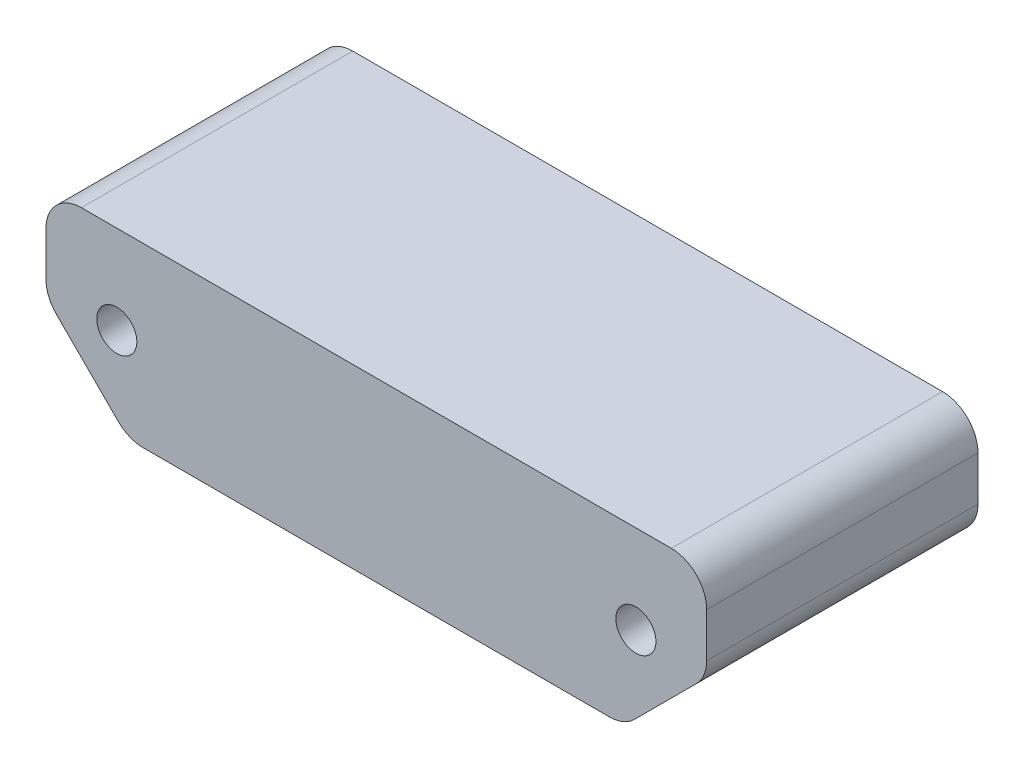
ISO-10303-21;
HEADER;
FILE_DESCRIPTION(('STEP AP214'),'2;1');
FILE_NAME('part.step','',(''),(''),'','','');
FILE_SCHEMA(('AUTOMOTIVE_DESIGN { 1 0 10303 214 1 1 1 1 }'));
ENDSEC;
DATA;
#1=APPLICATION_CONTEXT('core data for automotive mechanical design processes');
#2=APPLICATION_PROTOCOL_DEFINITION('international standard','automotive_design',2000,#1);
#3=PRODUCT_CONTEXT('',#1,'mechanical');
#4=PRODUCT('Part','Part','',(#3));
#5=PRODUCT_RELATED_PRODUCT_CATEGORY('part','',(#4));
#6=PRODUCT_DEFINITION_FORMATION('','',#4);
#7=PRODUCT_DEFINITION_CONTEXT('part definition',#1,'design');
#8=PRODUCT_DEFINITION('design','',#6,#7);
#9=PRODUCT_DEFINITION_SHAPE('','',#8);
#10=(LENGTH_UNIT() NAMED_UNIT(*) SI_UNIT(.MILLI.,.METRE.));
#11=(NAMED_UNIT(*) PLANE_ANGLE_UNIT() SI_UNIT($,.RADIAN.));
#12=(NAMED_UNIT(*) SI_UNIT($,.STERADIAN.) SOLID_ANGLE_UNIT());
#13=UNCERTAINTY_MEASURE_WITH_UNIT(LENGTH_MEASURE(1.E-05),#10,'distance_accuracy_value','');
#14=(GEOMETRIC_REPRESENTATION_CONTEXT(3) GLOBAL_UNCERTAINTY_ASSIGNED_CONTEXT((#13)) GLOBAL_UNIT_ASSIGNED_CONTEXT((#10,
#11,#12)) REPRESENTATION_CONTEXT('',''));
#15=CARTESIAN_POINT('',(0.,0.,0.));
#16=DIRECTION('',(0.,0.,1.));
#17=DIRECTION('',(1.,0.,0.));
#18=AXIS2_PLACEMENT_3D('',#15,#16,#17);
#19=CARTESIAN_POINT('',(0.,0.,23.));
#20=DIRECTION('',(0.,0.,-1.));
#21=DIRECTION('',(-1.,0.,0.));
#22=AXIS2_PLACEMENT_3D('',#19,#20,#21);
#23=PLANE('',#22);
#24=DIRECTION('',(1.,0.,0.));
#25=VECTOR('',#24,1.);
#26=CARTESIAN_POINT('',(-28.,-7.49999999999999,23.));
#27=LINE('',#26,#25);
#28=CARTESIAN_POINT('',(-19.7573593128807,-7.49999999999999,23.));
#29=VERTEX_POINT('',#28);
#30=CARTESIAN_POINT('',(19.7573593128807,-7.49999999999999,23.));
#31=VERTEX_POINT('',#30);
#32=EDGE_CURVE('E157',#29,#31,#27,.T.);
#33=ORIENTED_EDGE('',*,*,#32,.T.);
#34=CARTESIAN_POINT('',(19.7573593128807,-4.49999999999999,23.));
#35=DIRECTION('',(0.,0.,-1.));
#36=DIRECTION('',(-1.,0.,0.));
#37=AXIS2_PLACEMENT_3D('',#34,#35,#36);
#38=CIRCLE('',#37,3.);
#39=CARTESIAN_POINT('',(21.8786796564403,-6.62132034355964,23.));
#40=VERTEX_POINT('',#39);
#41=EDGE_CURVE('E211',#31,#40,#38,.F.);
#42=ORIENTED_EDGE('',*,*,#41,.T.);
#43=DIRECTION('',(-0.707106781186549,-0.707106781186546,0.));
#44=VECTOR('',#43,1.);
#45=CARTESIAN_POINT('',(28.,-0.5,23.));
#46=LINE('',#45,#44);
#47=CARTESIAN_POINT('',(27.1213203435596,-1.37867965644036,23.));
#48=VERTEX_POINT('',#47);
#49=EDGE_CURVE('E160',#40,#48,#46,.F.);
#50=ORIENTED_EDGE('',*,*,#49,.T.);
#51=CARTESIAN_POINT('',(25.,0.742640687119288,23.));
#52=DIRECTION('',(0.,0.,-1.));
#53=DIRECTION('',(-1.,0.,0.));
#54=AXIS2_PLACEMENT_3D('',#51,#52,#53);
#55=CIRCLE('',#54,3.);
#56=CARTESIAN_POINT('',(28.,0.74264068711929,23.));
#57=VERTEX_POINT('',#56);
#58=EDGE_CURVE('E208',#48,#57,#55,.F.);
#59=ORIENTED_EDGE('',*,*,#58,.T.);
#60=DIRECTION('',(0.,1.,0.));
#61=VECTOR('',#60,1.);
#62=CARTESIAN_POINT('',(28.,-7.49999999999999,23.));
#63=LINE('',#62,#61);
#64=CARTESIAN_POINT('',(28.,4.50000000000001,23.));
#65=VERTEX_POINT('',#64);
#66=EDGE_CURVE('E168',#57,#65,#63,.T.);
#67=ORIENTED_EDGE('',*,*,#66,.T.);
#68=CARTESIAN_POINT('',(25.,4.50000000000001,23.));
#69=DIRECTION('',(0.,0.,-1.));
#70=DIRECTION('',(-1.,0.,0.));
#71=AXIS2_PLACEMENT_3D('',#68,#69,#70);
#72=CIRCLE('',#71,3.);
#73=CARTESIAN_POINT('',(25.,7.50000000000001,23.));
#74=VERTEX_POINT('',#73);
#75=EDGE_CURVE('E205',#65,#74,#72,.F.);
#76=ORIENTED_EDGE('',*,*,#75,.T.);
#77=DIRECTION('',(-1.,0.,0.));
#78=VECTOR('',#77,1.);
#79=CARTESIAN_POINT('',(-28.,7.49999999999999,23.));
#80=LINE('',#79,#78);
#81=CARTESIAN_POINT('',(-25.,7.49999999999999,23.));
#82=VERTEX_POINT('',#81);
#83=EDGE_CURVE('E174',#74,#82,#80,.T.);
#84=ORIENTED_EDGE('',*,*,#83,.T.);
#85=CARTESIAN_POINT('',(-25.,4.49999999999999,23.));
#86=DIRECTION('',(0.,0.,-1.));
#87=DIRECTION('',(-1.,0.,0.));
#88=AXIS2_PLACEMENT_3D('',#85,#86,#87);
#89=CIRCLE('',#88,3.);
#90=CARTESIAN_POINT('',(-28.,4.49999999999999,23.));
#91=VERTEX_POINT('',#90);
#92=EDGE_CURVE('E202',#82,#91,#89,.F.);
#93=ORIENTED_EDGE('',*,*,#92,.T.);
#94=DIRECTION('',(0.,-1.,0.));
#95=VECTOR('',#94,1.);
#96=CARTESIAN_POINT('',(-28.,-7.49999999999999,23.));
#97=LINE('',#96,#95);
#98=CARTESIAN_POINT('',(-28.,0.742640687119316,23.));
#99=VERTEX_POINT('',#98);
#100=EDGE_CURVE('E263',#91,#99,#97,.T.);
#101=ORIENTED_EDGE('',*,*,#100,.T.);
#102=CARTESIAN_POINT('',(-25.,0.742640687119316,23.));
#103=DIRECTION('',(0.,0.,-1.));
#104=DIRECTION('',(-1.,0.,0.));
#105=AXIS2_PLACEMENT_3D('',#102,#103,#104);
#106=CIRCLE('',#105,3.);
#107=CARTESIAN_POINT('',(-27.1213203435596,-1.37867965644032,23.));
#108=VERTEX_POINT('',#107);
#109=EDGE_CURVE('E196',#99,#108,#106,.F.);
#110=ORIENTED_EDGE('',*,*,#109,.T.);
#111=DIRECTION('',(-0.707106781186546,0.707106781186549,0.));
#112=VECTOR('',#111,1.);
#113=CARTESIAN_POINT('',(-21.,-7.49999999999999,23.));
#114=LINE('',#113,#112);
#115=CARTESIAN_POINT('',(-21.8786796564404,-6.62132034355963,23.));
#116=VERTEX_POINT('',#115);
#117=EDGE_CURVE('E187',#108,#116,#114,.F.);
#118=ORIENTED_EDGE('',*,*,#117,.T.);
#119=CARTESIAN_POINT('',(-19.7573593128807,-4.49999999999999,23.));
#120=DIRECTION('',(0.,0.,-1.));
#121=DIRECTION('',(-1.,0.,0.));
#122=AXIS2_PLACEMENT_3D('',#119,#120,#121);
#123=CIRCLE('',#122,3.);
#124=EDGE_CURVE('E199',#116,#29,#123,.F.);
#125=ORIENTED_EDGE('',*,*,#124,.T.);
#126=EDGE_LOOP('',(#33,#42,#50,#59,#67,#76,#84,#93,#101,#110,#118,#125));
#127=FACE_BOUND('',#126,.T.);
#128=CARTESIAN_POINT('',(22.,0.,23.));
#129=DIRECTION('',(0.,0.,1.));
#130=DIRECTION('',(1.,0.,0.));
#131=AXIS2_PLACEMENT_3D('',#128,#129,#130);
#132=CIRCLE('',#131,1.7);
#133=CARTESIAN_POINT('',(23.7,0.,23.));
#134=VERTEX_POINT('',#133);
#135=EDGE_CURVE('E279',#134,#134,#132,.T.);
#136=ORIENTED_EDGE('',*,*,#135,.F.);
#137=EDGE_LOOP('',(#136));
#138=FACE_BOUND('',#137,.T.);
#139=CARTESIAN_POINT('',(-22.,0.,23.));
#140=DIRECTION('',(0.,0.,1.));
#141=DIRECTION('',(1.,0.,0.));
#142=AXIS2_PLACEMENT_3D('',#139,#140,#141);
#143=CIRCLE('',#142,1.7);
#144=CARTESIAN_POINT('',(-20.3,0.,23.));
#145=VERTEX_POINT('',#144);
#146=EDGE_CURVE('E449',#145,#145,#143,.T.);
#147=ORIENTED_EDGE('',*,*,#146,.F.);
#148=EDGE_LOOP('',(#147));
#149=FACE_BOUND('',#148,.T.);
#150=ADVANCED_FACE('F47',(#127,#138,#149),#23,.F.);
#151=CARTESIAN_POINT('',(0.,0.,0.));
#152=DIRECTION('',(0.,0.,-1.));
#153=DIRECTION('',(-1.,0.,0.));
#154=AXIS2_PLACEMENT_3D('',#151,#152,#153);
#155=PLANE('',#154);
#156=CARTESIAN_POINT('',(22.,0.,0.));
#157=DIRECTION('',(0.,0.,1.));
#158=DIRECTION('',(1.,0.,0.));
#159=AXIS2_PLACEMENT_3D('',#156,#157,#158);
#160=CIRCLE('',#159,1.7);
#161=CARTESIAN_POINT('',(23.7,0.,0.));
#162=VERTEX_POINT('',#161);
#163=EDGE_CURVE('E447',#162,#162,#160,.T.);
#164=ORIENTED_EDGE('',*,*,#163,.T.);
#165=EDGE_LOOP('',(#164));
#166=FACE_BOUND('',#165,.T.);
#167=DIRECTION('',(0.707106781186549,0.707106781186546,0.));
#168=VECTOR('',#167,1.);
#169=CARTESIAN_POINT('',(14.25,-14.25,0.));
#170=LINE('',#169,#168);
#171=CARTESIAN_POINT('',(27.1213203435596,-1.37867965644036,0.));
#172=VERTEX_POINT('',#171);
#173=CARTESIAN_POINT('',(21.8786796564403,-6.62132034355964,0.));
#174=VERTEX_POINT('',#173);
#175=EDGE_CURVE('E184',#172,#174,#170,.F.);
#176=ORIENTED_EDGE('',*,*,#175,.T.);
#177=CARTESIAN_POINT('',(19.7573593128807,-4.49999999999999,0.));
#178=DIRECTION('',(0.,0.,-1.));
#179=DIRECTION('',(-1.,0.,0.));
#180=AXIS2_PLACEMENT_3D('',#177,#178,#179);
#181=CIRCLE('',#180,3.);
#182=CARTESIAN_POINT('',(19.7573593128807,-7.49999999999999,0.));
#183=VERTEX_POINT('',#182);
#184=EDGE_CURVE('E166',#174,#183,#181,.T.);
#185=ORIENTED_EDGE('',*,*,#184,.T.);
#186=DIRECTION('',(1.,0.,0.));
#187=VECTOR('',#186,1.);
#188=CARTESIAN_POINT('',(-28.,-7.49999999999999,0.));
#189=LINE('',#188,#187);
#190=CARTESIAN_POINT('',(-19.7573593128807,-7.49999999999999,0.));
#191=VERTEX_POINT('',#190);
#192=EDGE_CURVE('E154',#191,#183,#189,.T.);
#193=ORIENTED_EDGE('',*,*,#192,.F.);
#194=CARTESIAN_POINT('',(-19.7573593128807,-4.49999999999999,0.));
#195=DIRECTION('',(0.,0.,-1.));
#196=DIRECTION('',(-1.,0.,0.));
#197=AXIS2_PLACEMENT_3D('',#194,#195,#196);
#198=CIRCLE('',#197,3.);
#199=CARTESIAN_POINT('',(-21.8786796564404,-6.62132034355963,0.));
#200=VERTEX_POINT('',#199);
#201=EDGE_CURVE('E138',#191,#200,#198,.T.);
#202=ORIENTED_EDGE('',*,*,#201,.T.);
#203=DIRECTION('',(0.707106781186546,-0.707106781186549,0.));
#204=VECTOR('',#203,1.);
#205=CARTESIAN_POINT('',(-14.25,-14.25,0.));
#206=LINE('',#205,#204);
#207=CARTESIAN_POINT('',(-27.1213203435596,-1.37867965644032,0.));
#208=VERTEX_POINT('',#207);
#209=EDGE_CURVE('E181',#200,#208,#206,.F.);
#210=ORIENTED_EDGE('',*,*,#209,.T.);
#211=CARTESIAN_POINT('',(-25.,0.742640687119316,0.));
#212=DIRECTION('',(0.,0.,-1.));
#213=DIRECTION('',(-1.,0.,0.));
#214=AXIS2_PLACEMENT_3D('',#211,#212,#213);
#215=CIRCLE('',#214,3.);
#216=CARTESIAN_POINT('',(-28.,0.742640687119316,0.));
#217=VERTEX_POINT('',#216);
#218=EDGE_CURVE('E147',#208,#217,#215,.T.);
#219=ORIENTED_EDGE('',*,*,#218,.T.);
#220=DIRECTION('',(0.,-1.,0.));
#221=VECTOR('',#220,1.);
#222=CARTESIAN_POINT('',(-28.,-7.49999999999999,0.));
#223=LINE('',#222,#221);
#224=CARTESIAN_POINT('',(-28.,4.49999999999999,0.));
#225=VERTEX_POINT('',#224);
#226=EDGE_CURVE('E169',#225,#217,#223,.T.);
#227=ORIENTED_EDGE('',*,*,#226,.F.);
#228=CARTESIAN_POINT('',(-25.,4.49999999999999,0.));
#229=DIRECTION('',(0.,0.,-1.));
#230=DIRECTION('',(-1.,0.,0.));
#231=AXIS2_PLACEMENT_3D('',#228,#229,#230);
#232=CIRCLE('',#231,3.);
#233=CARTESIAN_POINT('',(-25.,7.49999999999999,0.));
#234=VERTEX_POINT('',#233);
#235=EDGE_CURVE('E63',#225,#234,#232,.T.);
#236=ORIENTED_EDGE('',*,*,#235,.T.);
#237=DIRECTION('',(-1.,0.,0.));
#238=VECTOR('',#237,1.);
#239=CARTESIAN_POINT('',(-28.,7.49999999999999,0.));
#240=LINE('',#239,#238);
#241=CARTESIAN_POINT('',(25.,7.50000000000001,0.));
#242=VERTEX_POINT('',#241);
#243=EDGE_CURVE('E177',#242,#234,#240,.T.);
#244=ORIENTED_EDGE('',*,*,#243,.F.);
#245=CARTESIAN_POINT('',(25.,4.50000000000001,0.));
#246=DIRECTION('',(0.,0.,-1.));
#247=DIRECTION('',(-1.,0.,0.));
#248=AXIS2_PLACEMENT_3D('',#245,#246,#247);
#249=CIRCLE('',#248,3.);
#250=CARTESIAN_POINT('',(28.,4.50000000000001,0.));
#251=VERTEX_POINT('',#250);
#252=EDGE_CURVE('E71',#242,#251,#249,.T.);
#253=ORIENTED_EDGE('',*,*,#252,.T.);
#254=DIRECTION('',(0.,1.,0.));
#255=VECTOR('',#254,1.);
#256=CARTESIAN_POINT('',(28.,-7.49999999999999,0.));
#257=LINE('',#256,#255);
#258=CARTESIAN_POINT('',(28.,0.74264068711929,0.));
#259=VERTEX_POINT('',#258);
#260=EDGE_CURVE('E276',#259,#251,#257,.T.);
#261=ORIENTED_EDGE('',*,*,#260,.F.);
#262=CARTESIAN_POINT('',(25.,0.742640687119288,0.));
#263=DIRECTION('',(0.,0.,-1.));
#264=DIRECTION('',(-1.,0.,0.));
#265=AXIS2_PLACEMENT_3D('',#262,#263,#264);
#266=CIRCLE('',#265,3.);
#267=EDGE_CURVE('E226',#259,#172,#266,.T.);
#268=ORIENTED_EDGE('',*,*,#267,.T.);
#269=EDGE_LOOP('',(#176,#185,#193,#202,#210,#219,#227,#236,#244,#253,#261,#268));
#270=FACE_BOUND('',#269,.T.);
#271=CARTESIAN_POINT('',(-22.,0.,0.));
#272=DIRECTION('',(0.,0.,1.));
#273=DIRECTION('',(1.,0.,0.));
#274=AXIS2_PLACEMENT_3D('',#271,#272,#273);
#275=CIRCLE('',#274,1.7);
#276=CARTESIAN_POINT('',(-20.3,0.,0.));
#277=VERTEX_POINT('',#276);
#278=EDGE_CURVE('E455',#277,#277,#275,.T.);
#279=ORIENTED_EDGE('',*,*,#278,.T.);
#280=EDGE_LOOP('',(#279));
#281=FACE_BOUND('',#280,.T.);
#282=ADVANCED_FACE('F163',(#166,#270,#281),#155,.T.);
#283=CARTESIAN_POINT('',(28.,-7.49999999999999,23.));
#284=DIRECTION('',(-1.,0.,0.));
#285=DIRECTION('',(0.,-1.,0.));
#286=AXIS2_PLACEMENT_3D('',#283,#284,#285);
#287=PLANE('',#286);
#288=ORIENTED_EDGE('',*,*,#66,.F.);
#289=DIRECTION('',(0.,0.,1.));
#290=VECTOR('',#289,1.);
#291=CARTESIAN_POINT('',(28.,0.742640687119289,0.));
#292=LINE('',#291,#290);
#293=EDGE_CURVE('E234',#57,#259,#292,.F.);
#294=ORIENTED_EDGE('',*,*,#293,.T.);
#295=ORIENTED_EDGE('',*,*,#260,.T.);
#296=DIRECTION('',(0.,0.,-1.));
#297=VECTOR('',#296,1.);
#298=CARTESIAN_POINT('',(28.,4.50000000000001,23.));
#299=LINE('',#298,#297);
#300=EDGE_CURVE('E231',#251,#65,#299,.F.);
#301=ORIENTED_EDGE('',*,*,#300,.T.);
#302=EDGE_LOOP('',(#288,#294,#295,#301));
#303=FACE_BOUND('',#302,.T.);
#304=ADVANCED_FACE('F302',(#303),#287,.F.);
#305=CARTESIAN_POINT('',(-28.,7.49999999999999,23.));
#306=DIRECTION('',(0.,-1.,0.));
#307=DIRECTION('',(1.,0.,0.));
#308=AXIS2_PLACEMENT_3D('',#305,#306,#307);
#309=PLANE('',#308);
#310=ORIENTED_EDGE('',*,*,#83,.F.);
#311=DIRECTION('',(0.,0.,-1.));
#312=VECTOR('',#311,1.);
#313=CARTESIAN_POINT('',(25.,7.50000000000001,23.));
#314=LINE('',#313,#312);
#315=EDGE_CURVE('E241',#74,#242,#314,.T.);
#316=ORIENTED_EDGE('',*,*,#315,.T.);
#317=ORIENTED_EDGE('',*,*,#243,.T.);
#318=DIRECTION('',(0.,0.,-1.));
#319=VECTOR('',#318,1.);
#320=CARTESIAN_POINT('',(-25.,7.49999999999999,23.));
#321=LINE('',#320,#319);
#322=EDGE_CURVE('E238',#234,#82,#321,.F.);
#323=ORIENTED_EDGE('',*,*,#322,.T.);
#324=EDGE_LOOP('',(#310,#316,#317,#323));
#325=FACE_BOUND('',#324,.T.);
#326=ADVANCED_FACE('F284',(#325),#309,.F.);
#327=CARTESIAN_POINT('',(-28.,-7.49999999999999,23.));
#328=DIRECTION('',(1.,0.,0.));
#329=DIRECTION('',(0.,0.,-1.));
#330=AXIS2_PLACEMENT_3D('',#327,#328,#329);
#331=PLANE('',#330);
#332=ORIENTED_EDGE('',*,*,#100,.F.);
#333=DIRECTION('',(0.,0.,-1.));
#334=VECTOR('',#333,1.);
#335=CARTESIAN_POINT('',(-28.,4.49999999999999,23.));
#336=LINE('',#335,#334);
#337=EDGE_CURVE('E248',#91,#225,#336,.T.);
#338=ORIENTED_EDGE('',*,*,#337,.T.);
#339=ORIENTED_EDGE('',*,*,#226,.T.);
#340=DIRECTION('',(0.,0.,-1.));
#341=VECTOR('',#340,1.);
#342=CARTESIAN_POINT('',(-28.,0.742640687119316,23.));
#343=LINE('',#342,#341);
#344=EDGE_CURVE('E244',#217,#99,#343,.F.);
#345=ORIENTED_EDGE('',*,*,#344,.T.);
#346=EDGE_LOOP('',(#332,#338,#339,#345));
#347=FACE_BOUND('',#346,.T.);
#348=ADVANCED_FACE('F262',(#347),#331,.F.);
#349=CARTESIAN_POINT('',(-28.,-7.49999999999999,23.));
#350=DIRECTION('',(0.,1.,0.));
#351=DIRECTION('',(0.,0.,1.));
#352=AXIS2_PLACEMENT_3D('',#349,#350,#351);
#353=PLANE('',#352);
#354=ORIENTED_EDGE('',*,*,#192,.T.);
#355=DIRECTION('',(0.,0.,-1.));
#356=VECTOR('',#355,1.);
#357=CARTESIAN_POINT('',(19.7573593128807,-7.49999999999999,23.));
#358=LINE('',#357,#356);
#359=EDGE_CURVE('E159',#183,#31,#358,.F.);
#360=ORIENTED_EDGE('',*,*,#359,.T.);
#361=ORIENTED_EDGE('',*,*,#32,.F.);
#362=DIRECTION('',(0.,0.,1.));
#363=VECTOR('',#362,1.);
#364=CARTESIAN_POINT('',(-19.7573593128807,-7.49999999999999,0.));
#365=LINE('',#364,#363);
#366=EDGE_CURVE('E142',#29,#191,#365,.F.);
#367=ORIENTED_EDGE('',*,*,#366,.T.);
#368=EDGE_LOOP('',(#354,#360,#361,#367));
#369=FACE_BOUND('',#368,.T.);
#370=ADVANCED_FACE('F152',(#369),#353,.F.);
#371=CARTESIAN_POINT('',(22.,0.,23.));
#372=DIRECTION('',(0.,0.,-1.));
#373=DIRECTION('',(-1.,0.,0.));
#374=AXIS2_PLACEMENT_3D('',#371,#372,#373);
#375=CYLINDRICAL_SURFACE('',#374,1.7);
#376=ORIENTED_EDGE('',*,*,#135,.T.);
#377=EDGE_LOOP('',(#376));
#378=FACE_BOUND('',#377,.T.);
#379=ORIENTED_EDGE('',*,*,#163,.F.);
#380=EDGE_LOOP('',(#379));
#381=FACE_BOUND('',#380,.T.);
#382=ADVANCED_FACE('F306',(#378,#381),#375,.F.);
#383=CARTESIAN_POINT('',(-22.,0.,23.));
#384=DIRECTION('',(0.,0.,-1.));
#385=DIRECTION('',(-1.,0.,0.));
#386=AXIS2_PLACEMENT_3D('',#383,#384,#385);
#387=CYLINDRICAL_SURFACE('',#386,1.7);
#388=ORIENTED_EDGE('',*,*,#146,.T.);
#389=EDGE_LOOP('',(#388));
#390=FACE_BOUND('',#389,.T.);
#391=ORIENTED_EDGE('',*,*,#278,.F.);
#392=EDGE_LOOP('',(#391));
#393=FACE_BOUND('',#392,.T.);
#394=ADVANCED_FACE('F325',(#390,#393),#387,.F.);
#395=CARTESIAN_POINT('',(28.,-0.5,23.));
#396=DIRECTION('',(-0.707106781186546,0.707106781186549,0.));
#397=DIRECTION('',(0.,0.,-1.));
#398=AXIS2_PLACEMENT_3D('',#395,#396,#397);
#399=PLANE('',#398);
#400=ORIENTED_EDGE('',*,*,#49,.F.);
#401=DIRECTION('',(0.,0.,1.));
#402=VECTOR('',#401,1.);
#403=CARTESIAN_POINT('',(21.8786796564403,-6.62132034355964,0.));
#404=LINE('',#403,#402);
#405=EDGE_CURVE('E217',#40,#174,#404,.F.);
#406=ORIENTED_EDGE('',*,*,#405,.T.);
#407=ORIENTED_EDGE('',*,*,#175,.F.);
#408=DIRECTION('',(0.,0.,-1.));
#409=VECTOR('',#408,1.);
#410=CARTESIAN_POINT('',(27.1213203435596,-1.37867965644036,23.));
#411=LINE('',#410,#409);
#412=EDGE_CURVE('E214',#172,#48,#411,.F.);
#413=ORIENTED_EDGE('',*,*,#412,.T.);
#414=EDGE_LOOP('',(#400,#406,#407,#413));
#415=FACE_BOUND('',#414,.T.);
#416=ADVANCED_FACE('F319',(#415),#399,.F.);
#417=CARTESIAN_POINT('',(-21.,-7.49999999999999,23.));
#418=DIRECTION('',(0.707106781186549,0.707106781186546,0.));
#419=DIRECTION('',(0.,0.,-1.));
#420=AXIS2_PLACEMENT_3D('',#417,#418,#419);
#421=PLANE('',#420);
#422=ORIENTED_EDGE('',*,*,#209,.F.);
#423=DIRECTION('',(0.,0.,-1.));
#424=VECTOR('',#423,1.);
#425=CARTESIAN_POINT('',(-21.8786796564404,-6.62132034355963,23.));
#426=LINE('',#425,#424);
#427=EDGE_CURVE('E11',#200,#116,#426,.F.);
#428=ORIENTED_EDGE('',*,*,#427,.T.);
#429=ORIENTED_EDGE('',*,*,#117,.F.);
#430=DIRECTION('',(0.,0.,1.));
#431=VECTOR('',#430,1.);
#432=CARTESIAN_POINT('',(-27.1213203435596,-1.37867965644032,0.));
#433=LINE('',#432,#431);
#434=EDGE_CURVE('E56',#108,#208,#433,.F.);
#435=ORIENTED_EDGE('',*,*,#434,.T.);
#436=EDGE_LOOP('',(#422,#428,#429,#435));
#437=FACE_BOUND('',#436,.T.);
#438=ADVANCED_FACE('F255',(#437),#421,.F.);
#439=CARTESIAN_POINT('',(19.7573593128807,-4.49999999999999,23.));
#440=DIRECTION('',(0.,0.,1.));
#441=DIRECTION('',(1.,0.,0.));
#442=AXIS2_PLACEMENT_3D('',#439,#440,#441);
#443=CYLINDRICAL_SURFACE('',#442,3.);
#444=ORIENTED_EDGE('',*,*,#184,.F.);
#445=ORIENTED_EDGE('',*,*,#405,.F.);
#446=ORIENTED_EDGE('',*,*,#41,.F.);
#447=ORIENTED_EDGE('',*,*,#359,.F.);
#448=EDGE_LOOP('',(#444,#445,#446,#447));
#449=FACE_BOUND('',#448,.T.);
#450=ADVANCED_FACE('F331',(#449),#443,.T.);
#451=CARTESIAN_POINT('',(25.,0.742640687119288,23.));
#452=DIRECTION('',(0.,0.,-1.));
#453=DIRECTION('',(-1.,0.,0.));
#454=AXIS2_PLACEMENT_3D('',#451,#452,#453);
#455=CYLINDRICAL_SURFACE('',#454,3.);
#456=ORIENTED_EDGE('',*,*,#58,.F.);
#457=ORIENTED_EDGE('',*,*,#412,.F.);
#458=ORIENTED_EDGE('',*,*,#267,.F.);
#459=ORIENTED_EDGE('',*,*,#293,.F.);
#460=EDGE_LOOP('',(#456,#457,#458,#459));
#461=FACE_BOUND('',#460,.T.);
#462=ADVANCED_FACE('F294',(#461),#455,.T.);
#463=CARTESIAN_POINT('',(25.,4.50000000000001,23.));
#464=DIRECTION('',(0.,0.,-1.));
#465=DIRECTION('',(-1.,0.,0.));
#466=AXIS2_PLACEMENT_3D('',#463,#464,#465);
#467=CYLINDRICAL_SURFACE('',#466,3.);
#468=ORIENTED_EDGE('',*,*,#75,.F.);
#469=ORIENTED_EDGE('',*,*,#300,.F.);
#470=ORIENTED_EDGE('',*,*,#252,.F.);
#471=ORIENTED_EDGE('',*,*,#315,.F.);
#472=EDGE_LOOP('',(#468,#469,#470,#471));
#473=FACE_BOUND('',#472,.T.);
#474=ADVANCED_FACE('F288',(#473),#467,.T.);
#475=CARTESIAN_POINT('',(-25.,4.49999999999999,23.));
#476=DIRECTION('',(0.,0.,-1.));
#477=DIRECTION('',(-1.,0.,0.));
#478=AXIS2_PLACEMENT_3D('',#475,#476,#477);
#479=CYLINDRICAL_SURFACE('',#478,3.);
#480=ORIENTED_EDGE('',*,*,#92,.F.);
#481=ORIENTED_EDGE('',*,*,#322,.F.);
#482=ORIENTED_EDGE('',*,*,#235,.F.);
#483=ORIENTED_EDGE('',*,*,#337,.F.);
#484=EDGE_LOOP('',(#480,#481,#482,#483));
#485=FACE_BOUND('',#484,.T.);
#486=ADVANCED_FACE('F286',(#485),#479,.T.);
#487=CARTESIAN_POINT('',(-19.7573593128807,-4.49999999999999,23.));
#488=DIRECTION('',(0.,0.,-1.));
#489=DIRECTION('',(-1.,0.,0.));
#490=AXIS2_PLACEMENT_3D('',#487,#488,#489);
#491=CYLINDRICAL_SURFACE('',#490,3.);
#492=ORIENTED_EDGE('',*,*,#124,.F.);
#493=ORIENTED_EDGE('',*,*,#427,.F.);
#494=ORIENTED_EDGE('',*,*,#201,.F.);
#495=ORIENTED_EDGE('',*,*,#366,.F.);
#496=EDGE_LOOP('',(#492,#493,#494,#495));
#497=FACE_BOUND('',#496,.T.);
#498=ADVANCED_FACE('F141',(#497),#491,.T.);
#499=CARTESIAN_POINT('',(-25.,0.742640687119316,23.));
#500=DIRECTION('',(0.,0.,1.));
#501=DIRECTION('',(1.,0.,0.));
#502=AXIS2_PLACEMENT_3D('',#499,#500,#501);
#503=CYLINDRICAL_SURFACE('',#502,3.);
#504=ORIENTED_EDGE('',*,*,#218,.F.);
#505=ORIENTED_EDGE('',*,*,#434,.F.);
#506=ORIENTED_EDGE('',*,*,#109,.F.);
#507=ORIENTED_EDGE('',*,*,#344,.F.);
#508=EDGE_LOOP('',(#504,#505,#506,#507));
#509=FACE_BOUND('',#508,.T.);
#510=ADVANCED_FACE('F49',(#509),#503,.T.);
#511=CLOSED_SHELL('',(#150,#282,#304,#326,#348,#370,#382,#394,#416,#438,#450,#462,#474,#486,
#498,#510));
#512=MANIFOLD_SOLID_BREP('B2',#511);
#513=ADVANCED_BREP_SHAPE_REPRESENTATION('',(#18,#512),#14);
#514=SHAPE_DEFINITION_REPRESENTATION(#9,#513);
ENDSEC;
END-ISO-10303-21;
